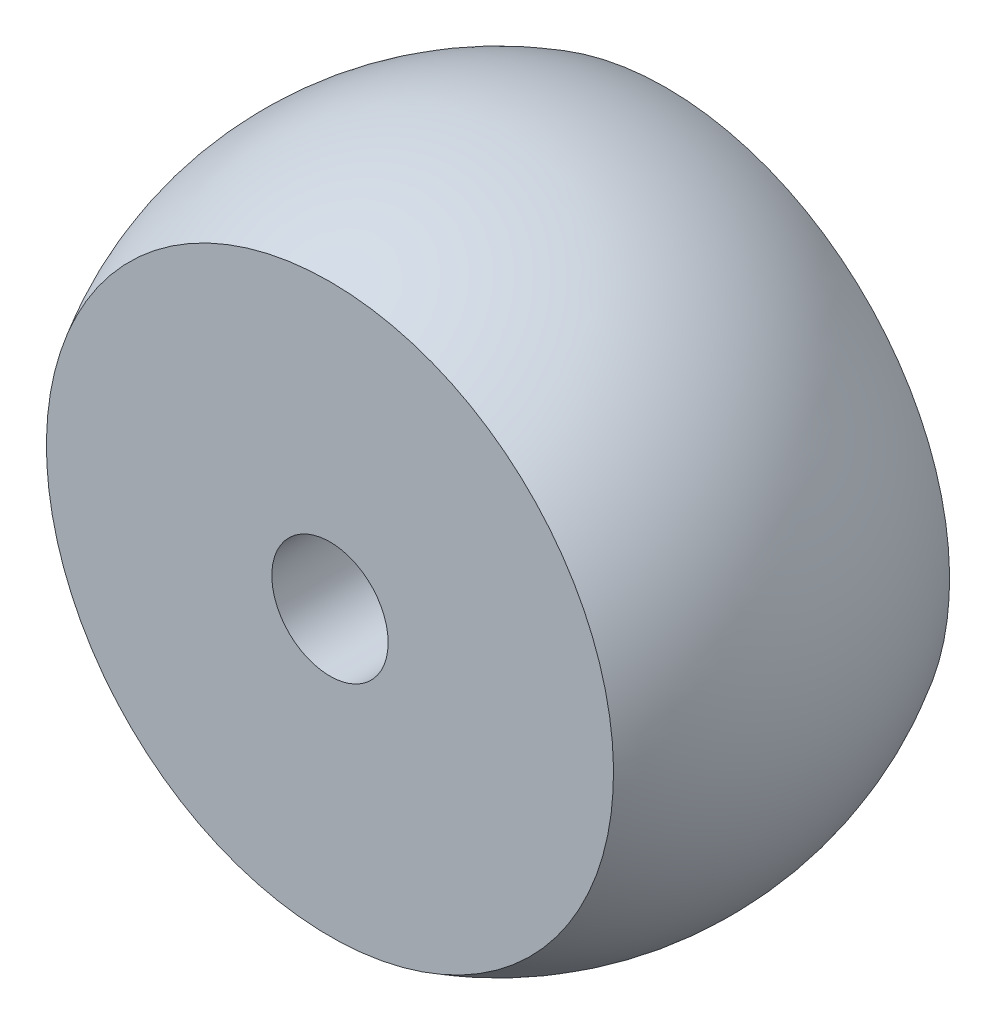
ISO-10303-21;
HEADER;
FILE_DESCRIPTION(('STEP AP214'),'2;1');
FILE_NAME('part.step','',(''),(''),'','','');
FILE_SCHEMA(('AUTOMOTIVE_DESIGN { 1 0 10303 214 1 1 1 1 }'));
ENDSEC;
DATA;
#1=APPLICATION_CONTEXT('core data for automotive mechanical design processes');
#2=APPLICATION_PROTOCOL_DEFINITION('international standard','automotive_design',2000,#1);
#3=PRODUCT_CONTEXT('',#1,'mechanical');
#4=PRODUCT('Part','Part','',(#3));
#5=PRODUCT_RELATED_PRODUCT_CATEGORY('part','',(#4));
#6=PRODUCT_DEFINITION_FORMATION('','',#4);
#7=PRODUCT_DEFINITION_CONTEXT('part definition',#1,'design');
#8=PRODUCT_DEFINITION('design','',#6,#7);
#9=PRODUCT_DEFINITION_SHAPE('','',#8);
#10=(LENGTH_UNIT() NAMED_UNIT(*) SI_UNIT(.MILLI.,.METRE.));
#11=(NAMED_UNIT(*) PLANE_ANGLE_UNIT() SI_UNIT($,.RADIAN.));
#12=(NAMED_UNIT(*) SI_UNIT($,.STERADIAN.) SOLID_ANGLE_UNIT());
#13=UNCERTAINTY_MEASURE_WITH_UNIT(LENGTH_MEASURE(1.E-05),#10,'distance_accuracy_value','');
#14=(GEOMETRIC_REPRESENTATION_CONTEXT(3) GLOBAL_UNCERTAINTY_ASSIGNED_CONTEXT((#13)) GLOBAL_UNIT_ASSIGNED_CONTEXT((#10,
#11,#12)) REPRESENTATION_CONTEXT('',''));
#15=CARTESIAN_POINT('',(0.,0.,0.));
#16=DIRECTION('',(0.,0.,1.));
#17=DIRECTION('',(1.,0.,0.));
#18=AXIS2_PLACEMENT_3D('',#15,#16,#17);
#19=CARTESIAN_POINT('',(0.,0.,6.5));
#20=DIRECTION('',(0.,0.,1.));
#21=DIRECTION('',(1.,0.,0.));
#22=AXIS2_PLACEMENT_3D('',#19,#20,#21);
#23=PLANE('',#22);
#24=CARTESIAN_POINT('',(0.,0.,6.5));
#25=DIRECTION('',(0.,0.,1.));
#26=DIRECTION('',(1.,0.,0.));
#27=AXIS2_PLACEMENT_3D('',#24,#25,#26);
#28=CIRCLE('',#27,2.25);
#29=CARTESIAN_POINT('',(2.25,0.,6.5));
#30=VERTEX_POINT('',#29);
#31=EDGE_CURVE('E36',#30,#30,#28,.T.);
#32=ORIENTED_EDGE('',*,*,#31,.F.);
#33=EDGE_LOOP('',(#32));
#34=FACE_BOUND('',#33,.T.);
#35=CARTESIAN_POINT('',(0.,0.,6.5));
#36=DIRECTION('',(0.,0.,1.));
#37=DIRECTION('',(1.,0.,0.));
#38=AXIS2_PLACEMENT_3D('',#35,#36,#37);
#39=CIRCLE('',#38,10.9687054842402);
#40=CARTESIAN_POINT('',(0.,10.9687054842402,6.5));
#41=VERTEX_POINT('',#40);
#42=EDGE_CURVE('E47',#41,#41,#39,.T.);
#43=ORIENTED_EDGE('',*,*,#42,.T.);
#44=EDGE_LOOP('',(#43));
#45=FACE_BOUND('',#44,.T.);
#46=ADVANCED_FACE('F32',(#34,#45),#23,.T.);
#47=CARTESIAN_POINT('',(0.,0.,-6.5));
#48=DIRECTION('',(0.,0.,1.));
#49=DIRECTION('',(1.,0.,0.));
#50=AXIS2_PLACEMENT_3D('',#47,#48,#49);
#51=PLANE('',#50);
#52=CARTESIAN_POINT('',(0.,0.,-6.5));
#53=DIRECTION('',(0.,0.,1.));
#54=DIRECTION('',(1.,0.,0.));
#55=AXIS2_PLACEMENT_3D('',#52,#53,#54);
#56=CIRCLE('',#55,2.25);
#57=CARTESIAN_POINT('',(2.25,0.,-6.5));
#58=VERTEX_POINT('',#57);
#59=EDGE_CURVE('E10',#58,#58,#56,.T.);
#60=ORIENTED_EDGE('',*,*,#59,.T.);
#61=EDGE_LOOP('',(#60));
#62=FACE_BOUND('',#61,.T.);
#63=CARTESIAN_POINT('',(0.,0.,-6.5));
#64=DIRECTION('',(0.,0.,1.));
#65=DIRECTION('',(1.,0.,0.));
#66=AXIS2_PLACEMENT_3D('',#63,#64,#65);
#67=CIRCLE('',#66,10.9687054842402);
#68=CARTESIAN_POINT('',(0.,10.9687054842402,-6.5));
#69=VERTEX_POINT('',#68);
#70=EDGE_CURVE('E43',#69,#69,#67,.T.);
#71=ORIENTED_EDGE('',*,*,#70,.F.);
#72=EDGE_LOOP('',(#71));
#73=FACE_BOUND('',#72,.T.);
#74=ADVANCED_FACE('F34',(#62,#73),#51,.F.);
#75=CARTESIAN_POINT('',(0.,0.,-6.5));
#76=DIRECTION('',(0.,0.,1.));
#77=DIRECTION('',(1.,0.,0.));
#78=AXIS2_PLACEMENT_3D('',#75,#76,#77);
#79=CYLINDRICAL_SURFACE('',#78,2.25);
#80=CARTESIAN_POINT('',(2.25,0.,-6.5));
#81=CARTESIAN_POINT('',(2.25,0.,-6.36458333333333));
#82=CARTESIAN_POINT('',(2.25,0.,-6.22916666666667));
#83=CARTESIAN_POINT('',(2.25,0.,-5.95833333333333));
#84=CARTESIAN_POINT('',(2.25,0.,-5.82291666666667));
#85=CARTESIAN_POINT('',(2.25,0.,-5.55208333333333));
#86=CARTESIAN_POINT('',(2.25,0.,-5.41666666666667));
#87=CARTESIAN_POINT('',(2.25,0.,-5.14583333333333));
#88=CARTESIAN_POINT('',(2.25,0.,-5.01041666666667));
#89=CARTESIAN_POINT('',(2.25,0.,-4.73958333333333));
#90=CARTESIAN_POINT('',(2.25,0.,-4.60416666666667));
#91=CARTESIAN_POINT('',(2.25,0.,-4.33333333333333));
#92=CARTESIAN_POINT('',(2.25,0.,-4.19791666666667));
#93=CARTESIAN_POINT('',(2.25,0.,-3.92708333333333));
#94=CARTESIAN_POINT('',(2.25,0.,-3.79166666666667));
#95=CARTESIAN_POINT('',(2.25,0.,-3.52083333333333));
#96=CARTESIAN_POINT('',(2.25,0.,-3.38541666666667));
#97=CARTESIAN_POINT('',(2.25,0.,-3.11458333333333));
#98=CARTESIAN_POINT('',(2.25,0.,-2.97916666666667));
#99=CARTESIAN_POINT('',(2.25,0.,-2.70833333333333));
#100=CARTESIAN_POINT('',(2.25,0.,-2.57291666666667));
#101=CARTESIAN_POINT('',(2.25,0.,-2.30208333333333));
#102=CARTESIAN_POINT('',(2.25,0.,-2.16666666666667));
#103=CARTESIAN_POINT('',(2.25,0.,-1.89583333333333));
#104=CARTESIAN_POINT('',(2.25,0.,-1.76041666666667));
#105=CARTESIAN_POINT('',(2.25,0.,-1.48958333333333));
#106=CARTESIAN_POINT('',(2.25,0.,-1.35416666666667));
#107=CARTESIAN_POINT('',(2.25,0.,-1.08333333333333));
#108=CARTESIAN_POINT('',(2.25,0.,-0.947916666666668));
#109=CARTESIAN_POINT('',(2.25,0.,-0.677083333333334));
#110=CARTESIAN_POINT('',(2.25,0.,-0.541666666666668));
#111=CARTESIAN_POINT('',(2.25,0.,-0.270833333333334));
#112=CARTESIAN_POINT('',(2.25,0.,-0.135416666666668));
#113=CARTESIAN_POINT('',(2.25,0.,0.135416666666666));
#114=CARTESIAN_POINT('',(2.25,0.,0.270833333333333));
#115=CARTESIAN_POINT('',(2.25,0.,0.541666666666666));
#116=CARTESIAN_POINT('',(2.25,0.,0.677083333333332));
#117=CARTESIAN_POINT('',(2.25,0.,0.947916666666666));
#118=CARTESIAN_POINT('',(2.25,0.,1.08333333333333));
#119=CARTESIAN_POINT('',(2.25,0.,1.35416666666667));
#120=CARTESIAN_POINT('',(2.25,0.,1.48958333333333));
#121=CARTESIAN_POINT('',(2.25,0.,1.76041666666667));
#122=CARTESIAN_POINT('',(2.25,0.,1.89583333333333));
#123=CARTESIAN_POINT('',(2.25,0.,2.16666666666667));
#124=CARTESIAN_POINT('',(2.25,0.,2.30208333333333));
#125=CARTESIAN_POINT('',(2.25,0.,2.57291666666667));
#126=CARTESIAN_POINT('',(2.25,0.,2.70833333333333));
#127=CARTESIAN_POINT('',(2.25,0.,2.97916666666667));
#128=CARTESIAN_POINT('',(2.25,0.,3.11458333333333));
#129=CARTESIAN_POINT('',(2.25,0.,3.38541666666667));
#130=CARTESIAN_POINT('',(2.25,0.,3.52083333333333));
#131=CARTESIAN_POINT('',(2.25,0.,3.79166666666667));
#132=CARTESIAN_POINT('',(2.25,0.,3.92708333333333));
#133=CARTESIAN_POINT('',(2.25,0.,4.19791666666667));
#134=CARTESIAN_POINT('',(2.25,0.,4.33333333333333));
#135=CARTESIAN_POINT('',(2.25,0.,4.60416666666667));
#136=CARTESIAN_POINT('',(2.25,0.,4.73958333333333));
#137=CARTESIAN_POINT('',(2.25,0.,5.01041666666667));
#138=CARTESIAN_POINT('',(2.25,0.,5.14583333333333));
#139=CARTESIAN_POINT('',(2.25,0.,5.41666666666667));
#140=CARTESIAN_POINT('',(2.25,0.,5.55208333333333));
#141=CARTESIAN_POINT('',(2.25,0.,5.82291666666667));
#142=CARTESIAN_POINT('',(2.25,0.,5.95833333333333));
#143=CARTESIAN_POINT('',(2.25,0.,6.22916666666667));
#144=CARTESIAN_POINT('',(2.25,0.,6.36458333333333));
#145=CARTESIAN_POINT('',(2.25,0.,6.5));
#146=B_SPLINE_CURVE_WITH_KNOTS('',3,(#80,#81,#82,#83,#84,#85,#86,#87,#88,#89,#90,#91,#92,#93,
#94,#95,#96,#97,#98,#99,#100,#101,#102,#103,#104,#105,#106,#107,#108,#109,#110,#111,#112,#113,
#114,#115,#116,#117,#118,#119,#120,#121,#122,#123,#124,#125,#126,#127,#128,#129,#130,#131,#132,
#133,#134,#135,#136,#137,#138,#139,#140,#141,#142,#143,#144,#145),.UNSPECIFIED.,.F.,.F.,(4,2,2,
2,2,2,2,2,2,2,2,2,2,2,2,2,2,2,2,2,2,2,2,2,2,2,2,2,2,2,2,2,4),(0.,0.40625,0.812500000000001,
1.21875,1.625,2.03125,2.4375,2.84375,3.25,3.65625,4.0625,4.46875,4.875,5.28125,5.6875,6.09375,
6.5,6.90625,7.3125,7.71875,8.125,8.53125,8.9375,9.34375,9.75,10.15625,10.5625,10.96875,11.375,
11.78125,12.1875,12.59375,13.),.UNSPECIFIED.);
#147=EDGE_CURVE('BSEAM55',#58,#30,#146,.T.);
#148=ORIENTED_EDGE('',*,*,#59,.F.);
#149=ORIENTED_EDGE('',*,*,#31,.T.);
#150=ORIENTED_EDGE('',*,*,#147,.T.);
#151=ORIENTED_EDGE('',*,*,#147,.F.);
#152=EDGE_LOOP('',(#148,#150,#149,#151));
#153=FACE_BOUND('',#152,.T.);
#154=ADVANCED_FACE('F55',(#153),#79,.F.);
#155=CARTESIAN_POINT('',(0.,0.,0.));
#156=DIRECTION('',(0.,0.,1.));
#157=DIRECTION('',(0.,1.,0.));
#158=AXIS2_PLACEMENT_3D('',#155,#156,#157);
#159=SPHERICAL_SURFACE('',#158,12.75);
#160=CARTESIAN_POINT('',(0.,10.9687054842402,6.5));
#161=CARTESIAN_POINT('',(0.,11.0411483938904,6.37775495567485));
#162=CARTESIAN_POINT('',(0.,11.1115460376069,6.25429796117211));
#163=CARTESIAN_POINT('',(0.,11.2481757761674,6.00510008321101));
#164=CARTESIAN_POINT('',(0.,11.3144078710115,5.87935919975266));
#165=CARTESIAN_POINT('',(0.,11.442631494822,5.62573355527994));
#166=CARTESIAN_POINT('',(0.,11.5046230237885,5.49784879426557));
#167=CARTESIAN_POINT('',(0.,11.6242964864851,5.2400784865128));
#168=CARTESIAN_POINT('',(0.,11.6819784202153,5.11019293977439));
#169=CARTESIAN_POINT('',(0.,11.7929681459699,4.84856620555844));
#170=CARTESIAN_POINT('',(0.,11.8462759379944,4.71682501808088));
#171=CARTESIAN_POINT('',(0.,11.9484578127799,4.45163427068541));
#172=CARTESIAN_POINT('',(0.,11.9973318955409,4.31818471076749));
#173=CARTESIAN_POINT('',(0.,12.0905917161602,4.04972638321838));
#174=CARTESIAN_POINT('',(0.,12.1349774540186,3.91471761558719));
#175=CARTESIAN_POINT('',(0.,12.2192109726155,3.64329178371891));
#176=CARTESIAN_POINT('',(0.,12.2590587533541,3.50687471948184));
#177=CARTESIAN_POINT('',(0.,12.3341718162177,3.2327847787329));
#178=CARTESIAN_POINT('',(0.,12.3694370983427,3.09511190222104));
#179=CARTESIAN_POINT('',(0.,12.4353457451812,2.81866422523108));
#180=CARTESIAN_POINT('',(0.,12.4659891098947,2.67988942475298));
#181=CARTESIAN_POINT('',(0.,12.5226196692843,2.40139301978195));
#182=CARTESIAN_POINT('',(0.,12.5486068639605,2.26167141528902));
#183=CARTESIAN_POINT('',(0.,12.5958960352656,1.98143758057837));
#184=CARTESIAN_POINT('',(0.,12.6171980118946,1.84092535036063));
#185=CARTESIAN_POINT('',(0.,12.6550929361386,1.55926732623267));
#186=CARTESIAN_POINT('',(0.,12.6716858837537,1.41812153232244));
#187=CARTESIAN_POINT('',(0.,12.7001442026734,1.13535415102915));
#188=CARTESIAN_POINT('',(0.,12.712009573978,0.993732563646094));
#189=CARTESIAN_POINT('',(0.,12.7309994773788,0.710171897459808));
#190=CARTESIAN_POINT('',(0.,12.7381240094749,0.568232818656583));
#191=CARTESIAN_POINT('',(0.,12.7476242707855,0.284195826568906));
#192=CARTESIAN_POINT('',(0.,12.75,0.142097913284453));
#193=CARTESIAN_POINT('',(0.,12.75,-0.142097913284453));
#194=CARTESIAN_POINT('',(0.,12.7476242707855,-0.284195826568906));
#195=CARTESIAN_POINT('',(0.,12.7381240094749,-0.568232818656583));
#196=CARTESIAN_POINT('',(0.,12.7309994773788,-0.710171897459808));
#197=CARTESIAN_POINT('',(0.,12.712009573978,-0.993732563646094));
#198=CARTESIAN_POINT('',(0.,12.7001442026734,-1.13535415102915));
#199=CARTESIAN_POINT('',(0.,12.6716858837537,-1.41812153232244));
#200=CARTESIAN_POINT('',(0.,12.6550929361386,-1.55926732623267));
#201=CARTESIAN_POINT('',(0.,12.6171980118946,-1.84092535036063));
#202=CARTESIAN_POINT('',(0.,12.5958960352656,-1.98143758057837));
#203=CARTESIAN_POINT('',(0.,12.5486068639605,-2.26167141528902));
#204=CARTESIAN_POINT('',(0.,12.5226196692843,-2.40139301978195));
#205=CARTESIAN_POINT('',(0.,12.4659891098947,-2.67988942475298));
#206=CARTESIAN_POINT('',(0.,12.4353457451812,-2.81866422523108));
#207=CARTESIAN_POINT('',(0.,12.3694370983427,-3.09511190222104));
#208=CARTESIAN_POINT('',(0.,12.3341718162177,-3.2327847787329));
#209=CARTESIAN_POINT('',(0.,12.2590587533541,-3.50687471948184));
#210=CARTESIAN_POINT('',(0.,12.2192109726155,-3.64329178371891));
#211=CARTESIAN_POINT('',(0.,12.1349774540186,-3.91471761558719));
#212=CARTESIAN_POINT('',(0.,12.0905917161602,-4.04972638321838));
#213=CARTESIAN_POINT('',(0.,11.9973318955409,-4.31818471076749));
#214=CARTESIAN_POINT('',(0.,11.9484578127799,-4.45163427068541));
#215=CARTESIAN_POINT('',(0.,11.8462759379944,-4.71682501808088));
#216=CARTESIAN_POINT('',(0.,11.7929681459699,-4.84856620555844));
#217=CARTESIAN_POINT('',(0.,11.6819784202153,-5.11019293977439));
#218=CARTESIAN_POINT('',(0.,11.6242964864851,-5.2400784865128));
#219=CARTESIAN_POINT('',(0.,11.5046230237885,-5.49784879426557));
#220=CARTESIAN_POINT('',(0.,11.442631494822,-5.62573355527993));
#221=CARTESIAN_POINT('',(0.,11.3144078710115,-5.87935919975266));
#222=CARTESIAN_POINT('',(0.,11.2481757761674,-6.00510008321101));
#223=CARTESIAN_POINT('',(0.,11.1115460376069,-6.25429796117211));
#224=CARTESIAN_POINT('',(0.,11.0411483938904,-6.37775495567485));
#225=CARTESIAN_POINT('',(0.,10.9687054842402,-6.5));
#226=B_SPLINE_CURVE_WITH_KNOTS('',3,(#160,#161,#162,#163,#164,#165,#166,#167,#168,#169,#170,
#171,#172,#173,#174,#175,#176,#177,#178,#179,#180,#181,#182,#183,#184,#185,#186,#187,#188,#189,
#190,#191,#192,#193,#194,#195,#196,#197,#198,#199,#200,#201,#202,#203,#204,#205,#206,#207,#208,
#209,#210,#211,#212,#213,#214,#215,#216,#217,#218,#219,#220,#221,#222,#223,#224,#225),
.UNSPECIFIED.,.F.,.F.,(4,2,2,2,2,2,2,2,2,2,2,2,2,2,2,2,2,2,2,2,2,2,2,2,2,2,2,2,2,2,2,2,4),(0.,
0.426273886930837,0.852547773861673,1.27882166079251,1.70509554772335,2.13136943465419,
2.55764332158502,2.98391720851586,3.4101910954467,3.83646498237753,4.26273886930837,
4.68901275623921,5.11528664317005,5.54156053010088,5.96783441703172,6.39410830396256,
6.82038219089339,7.24665607782423,7.67292996475507,8.09920385168591,8.52547773861674,
8.95175162554758,9.37802551247842,9.80429939940925,10.2305732863401,10.6568471732709,
11.0831210602018,11.5093949471326,11.9356688340634,12.3619427209943,12.7882166079251,
13.2144904948559,13.6407643817868),.UNSPECIFIED.);
#227=EDGE_CURVE('BSEAM52',#41,#69,#226,.T.);
#228=ORIENTED_EDGE('',*,*,#42,.F.);
#229=ORIENTED_EDGE('',*,*,#70,.T.);
#230=ORIENTED_EDGE('',*,*,#227,.T.);
#231=ORIENTED_EDGE('',*,*,#227,.F.);
#232=EDGE_LOOP('',(#228,#230,#229,#231));
#233=FACE_BOUND('',#232,.T.);
#234=ADVANCED_FACE('F52',(#233),#159,.T.);
#235=CLOSED_SHELL('',(#46,#74,#154,#234));
#236=MANIFOLD_SOLID_BREP('B2',#235);
#237=ADVANCED_BREP_SHAPE_REPRESENTATION('',(#18,#236),#14);
#238=SHAPE_DEFINITION_REPRESENTATION(#9,#237);
ENDSEC;
END-ISO-10303-21;
